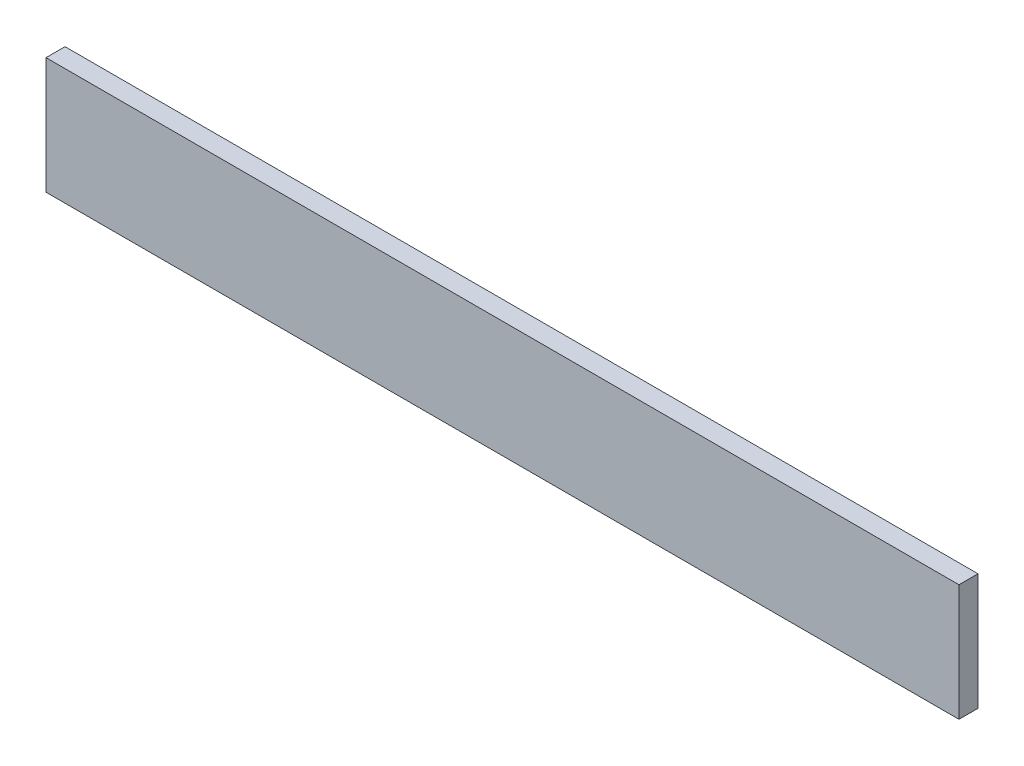
ISO-10303-21;
HEADER;
FILE_DESCRIPTION(('STEP AP214'),'2;1');
FILE_NAME('part.step','',(''),(''),'','','');
FILE_SCHEMA(('AUTOMOTIVE_DESIGN { 1 0 10303 214 1 1 1 1 }'));
ENDSEC;
DATA;
#1=APPLICATION_CONTEXT('core data for automotive mechanical design processes');
#2=APPLICATION_PROTOCOL_DEFINITION('international standard','automotive_design',2000,#1);
#3=PRODUCT_CONTEXT('',#1,'mechanical');
#4=PRODUCT('Part','Part','',(#3));
#5=PRODUCT_RELATED_PRODUCT_CATEGORY('part','',(#4));
#6=PRODUCT_DEFINITION_FORMATION('','',#4);
#7=PRODUCT_DEFINITION_CONTEXT('part definition',#1,'design');
#8=PRODUCT_DEFINITION('design','',#6,#7);
#9=PRODUCT_DEFINITION_SHAPE('','',#8);
#10=(LENGTH_UNIT() NAMED_UNIT(*) SI_UNIT(.MILLI.,.METRE.));
#11=(NAMED_UNIT(*) PLANE_ANGLE_UNIT() SI_UNIT($,.RADIAN.));
#12=(NAMED_UNIT(*) SI_UNIT($,.STERADIAN.) SOLID_ANGLE_UNIT());
#13=UNCERTAINTY_MEASURE_WITH_UNIT(LENGTH_MEASURE(1.E-05),#10,'distance_accuracy_value','');
#14=(GEOMETRIC_REPRESENTATION_CONTEXT(3) GLOBAL_UNCERTAINTY_ASSIGNED_CONTEXT((#13)) GLOBAL_UNIT_ASSIGNED_CONTEXT((#10,
#11,#12)) REPRESENTATION_CONTEXT('',''));
#15=CARTESIAN_POINT('',(0.,0.,0.));
#16=DIRECTION('',(0.,0.,1.));
#17=DIRECTION('',(1.,0.,0.));
#18=AXIS2_PLACEMENT_3D('',#15,#16,#17);
#19=CARTESIAN_POINT('',(-124.420624744802,-80.8036477042492,19.05));
#20=DIRECTION('',(0.,1.,0.));
#21=DIRECTION('',(0.,0.,1.));
#22=AXIS2_PLACEMENT_3D('',#19,#20,#21);
#23=PLANE('',#22);
#24=DIRECTION('',(1.,0.,0.));
#25=VECTOR('',#24,1.);
#26=CARTESIAN_POINT('',(-124.420624744802,-80.8036477042492,0.));
#27=LINE('',#26,#25);
#28=CARTESIAN_POINT('',(-124.420624744802,-80.8036477042492,0.));
#29=VERTEX_POINT('',#28);
#30=CARTESIAN_POINT('',(789.979375255198,-80.8036477042492,0.));
#31=VERTEX_POINT('',#30);
#32=EDGE_CURVE('E96',#29,#31,#27,.T.);
#33=ORIENTED_EDGE('',*,*,#32,.T.);
#34=DIRECTION('',(0.,0.,-1.));
#35=VECTOR('',#34,1.);
#36=CARTESIAN_POINT('',(789.979375255198,-80.8036477042492,19.05));
#37=LINE('',#36,#35);
#38=CARTESIAN_POINT('',(789.979375255198,-80.8036477042492,19.05));
#39=VERTEX_POINT('',#38);
#40=EDGE_CURVE('E11',#39,#31,#37,.T.);
#41=ORIENTED_EDGE('',*,*,#40,.F.);
#42=DIRECTION('',(1.,0.,0.));
#43=VECTOR('',#42,1.);
#44=CARTESIAN_POINT('',(-124.420624744802,-80.8036477042492,19.05));
#45=LINE('',#44,#43);
#46=CARTESIAN_POINT('',(-124.420624744802,-80.8036477042492,19.05));
#47=VERTEX_POINT('',#46);
#48=EDGE_CURVE('E73',#47,#39,#45,.T.);
#49=ORIENTED_EDGE('',*,*,#48,.F.);
#50=DIRECTION('',(0.,0.,-1.));
#51=VECTOR('',#50,1.);
#52=CARTESIAN_POINT('',(-124.420624744802,-80.8036477042492,19.05));
#53=LINE('',#52,#51);
#54=EDGE_CURVE('E92',#47,#29,#53,.T.);
#55=ORIENTED_EDGE('',*,*,#54,.T.);
#56=EDGE_LOOP('',(#33,#41,#49,#55));
#57=FACE_BOUND('',#56,.T.);
#58=ADVANCED_FACE('F34',(#57),#23,.F.);
#59=CARTESIAN_POINT('',(789.979375255198,35.9396819277508,19.05));
#60=DIRECTION('',(1.,0.,0.));
#61=DIRECTION('',(0.,0.,-1.));
#62=AXIS2_PLACEMENT_3D('',#59,#60,#61);
#63=PLANE('',#62);
#64=DIRECTION('',(0.,-1.,0.));
#65=VECTOR('',#64,1.);
#66=CARTESIAN_POINT('',(789.979375255198,35.9396819277508,0.));
#67=LINE('',#66,#65);
#68=CARTESIAN_POINT('',(789.979375255198,35.9396819277508,0.));
#69=VERTEX_POINT('',#68);
#70=EDGE_CURVE('E82',#69,#31,#67,.T.);
#71=ORIENTED_EDGE('',*,*,#70,.F.);
#72=DIRECTION('',(0.,0.,-1.));
#73=VECTOR('',#72,1.);
#74=CARTESIAN_POINT('',(789.979375255198,35.9396819277508,19.05));
#75=LINE('',#74,#73);
#76=CARTESIAN_POINT('',(789.979375255198,35.9396819277508,19.05));
#77=VERTEX_POINT('',#76);
#78=EDGE_CURVE('E42',#77,#69,#75,.T.);
#79=ORIENTED_EDGE('',*,*,#78,.F.);
#80=DIRECTION('',(0.,-1.,0.));
#81=VECTOR('',#80,1.);
#82=CARTESIAN_POINT('',(789.979375255198,35.9396819277508,19.05));
#83=LINE('',#82,#81);
#84=EDGE_CURVE('E80',#77,#39,#83,.T.);
#85=ORIENTED_EDGE('',*,*,#84,.T.);
#86=ORIENTED_EDGE('',*,*,#40,.T.);
#87=EDGE_LOOP('',(#71,#79,#85,#86));
#88=FACE_BOUND('',#87,.T.);
#89=ADVANCED_FACE('F79',(#88),#63,.T.);
#90=CARTESIAN_POINT('',(-124.420624744802,35.9396819277508,19.05));
#91=DIRECTION('',(0.,1.,0.));
#92=DIRECTION('',(0.,0.,1.));
#93=AXIS2_PLACEMENT_3D('',#90,#91,#92);
#94=PLANE('',#93);
#95=DIRECTION('',(1.,0.,0.));
#96=VECTOR('',#95,1.);
#97=CARTESIAN_POINT('',(-124.420624744802,35.9396819277508,0.));
#98=LINE('',#97,#96);
#99=CARTESIAN_POINT('',(-124.420624744802,35.9396819277508,0.));
#100=VERTEX_POINT('',#99);
#101=EDGE_CURVE('E100',#100,#69,#98,.T.);
#102=ORIENTED_EDGE('',*,*,#101,.F.);
#103=DIRECTION('',(0.,0.,-1.));
#104=VECTOR('',#103,1.);
#105=CARTESIAN_POINT('',(-124.420624744802,35.9396819277508,19.05));
#106=LINE('',#105,#104);
#107=CARTESIAN_POINT('',(-124.420624744802,35.9396819277508,19.05));
#108=VERTEX_POINT('',#107);
#109=EDGE_CURVE('E65',#108,#100,#106,.T.);
#110=ORIENTED_EDGE('',*,*,#109,.F.);
#111=DIRECTION('',(1.,0.,0.));
#112=VECTOR('',#111,1.);
#113=CARTESIAN_POINT('',(-124.420624744802,35.9396819277508,19.05));
#114=LINE('',#113,#112);
#115=EDGE_CURVE('E88',#108,#77,#114,.T.);
#116=ORIENTED_EDGE('',*,*,#115,.T.);
#117=ORIENTED_EDGE('',*,*,#78,.T.);
#118=EDGE_LOOP('',(#102,#110,#116,#117));
#119=FACE_BOUND('',#118,.T.);
#120=ADVANCED_FACE('F90',(#119),#94,.T.);
#121=CARTESIAN_POINT('',(-124.420624744802,35.9396819277508,19.05));
#122=DIRECTION('',(1.,0.,0.));
#123=DIRECTION('',(0.,1.,0.));
#124=AXIS2_PLACEMENT_3D('',#121,#122,#123);
#125=PLANE('',#124);
#126=DIRECTION('',(0.,-1.,0.));
#127=VECTOR('',#126,1.);
#128=CARTESIAN_POINT('',(-124.420624744802,35.9396819277508,0.));
#129=LINE('',#128,#127);
#130=EDGE_CURVE('E68',#100,#29,#129,.T.);
#131=ORIENTED_EDGE('',*,*,#130,.T.);
#132=ORIENTED_EDGE('',*,*,#54,.F.);
#133=DIRECTION('',(0.,-1.,0.));
#134=VECTOR('',#133,1.);
#135=CARTESIAN_POINT('',(-124.420624744802,35.9396819277508,19.05));
#136=LINE('',#135,#134);
#137=EDGE_CURVE('E50',#108,#47,#136,.T.);
#138=ORIENTED_EDGE('',*,*,#137,.F.);
#139=ORIENTED_EDGE('',*,*,#109,.T.);
#140=EDGE_LOOP('',(#131,#132,#138,#139));
#141=FACE_BOUND('',#140,.T.);
#142=ADVANCED_FACE('F113',(#141),#125,.F.);
#143=CARTESIAN_POINT('',(0.,0.,19.05));
#144=DIRECTION('',(0.,0.,-1.));
#145=DIRECTION('',(-1.,0.,0.));
#146=AXIS2_PLACEMENT_3D('',#143,#144,#145);
#147=PLANE('',#146);
#148=ORIENTED_EDGE('',*,*,#48,.T.);
#149=ORIENTED_EDGE('',*,*,#84,.F.);
#150=ORIENTED_EDGE('',*,*,#115,.F.);
#151=ORIENTED_EDGE('',*,*,#137,.T.);
#152=EDGE_LOOP('',(#148,#149,#150,#151));
#153=FACE_BOUND('',#152,.T.);
#154=ADVANCED_FACE('F87',(#153),#147,.F.);
#155=CARTESIAN_POINT('',(0.,0.,0.));
#156=DIRECTION('',(0.,0.,-1.));
#157=DIRECTION('',(-1.,0.,0.));
#158=AXIS2_PLACEMENT_3D('',#155,#156,#157);
#159=PLANE('',#158);
#160=ORIENTED_EDGE('',*,*,#32,.F.);
#161=ORIENTED_EDGE('',*,*,#130,.F.);
#162=ORIENTED_EDGE('',*,*,#101,.T.);
#163=ORIENTED_EDGE('',*,*,#70,.T.);
#164=EDGE_LOOP('',(#160,#161,#162,#163));
#165=FACE_BOUND('',#164,.T.);
#166=ADVANCED_FACE('F107',(#165),#159,.T.);
#167=CLOSED_SHELL('',(#58,#89,#120,#142,#154,#166));
#168=MANIFOLD_SOLID_BREP('B2',#167);
#169=ADVANCED_BREP_SHAPE_REPRESENTATION('',(#18,#168),#14);
#170=SHAPE_DEFINITION_REPRESENTATION(#9,#169);
ENDSEC;
END-ISO-10303-21;
